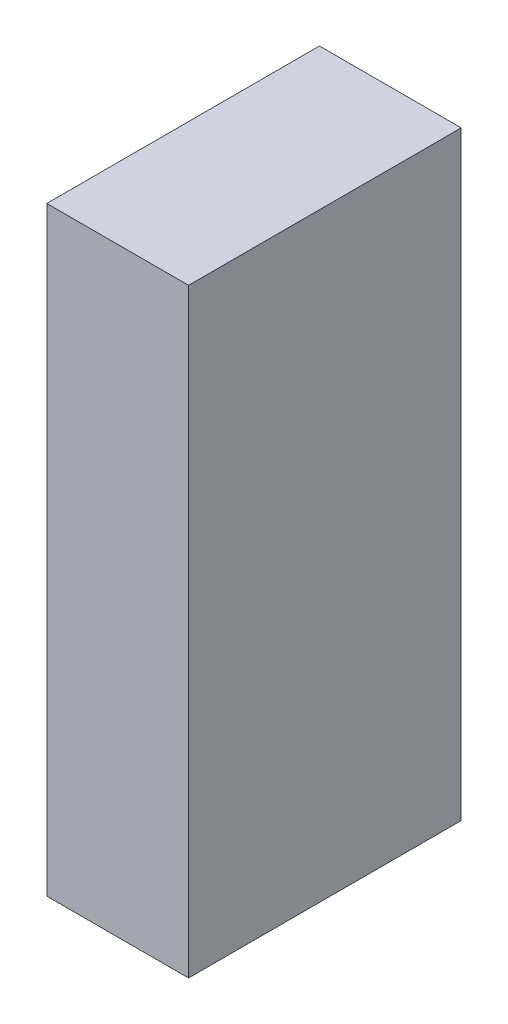
ISO-10303-21;
HEADER;
FILE_DESCRIPTION(('STEP AP214'),'2;1');
FILE_NAME('part.step','',(''),(''),'','','');
FILE_SCHEMA(('AUTOMOTIVE_DESIGN { 1 0 10303 214 1 1 1 1 }'));
ENDSEC;
DATA;
#1=APPLICATION_CONTEXT('core data for automotive mechanical design processes');
#2=APPLICATION_PROTOCOL_DEFINITION('international standard','automotive_design',2000,#1);
#3=PRODUCT_CONTEXT('',#1,'mechanical');
#4=PRODUCT('Part','Part','',(#3));
#5=PRODUCT_RELATED_PRODUCT_CATEGORY('part','',(#4));
#6=PRODUCT_DEFINITION_FORMATION('','',#4);
#7=PRODUCT_DEFINITION_CONTEXT('part definition',#1,'design');
#8=PRODUCT_DEFINITION('design','',#6,#7);
#9=PRODUCT_DEFINITION_SHAPE('','',#8);
#10=(LENGTH_UNIT() NAMED_UNIT(*) SI_UNIT(.MILLI.,.METRE.));
#11=(NAMED_UNIT(*) PLANE_ANGLE_UNIT() SI_UNIT($,.RADIAN.));
#12=(NAMED_UNIT(*) SI_UNIT($,.STERADIAN.) SOLID_ANGLE_UNIT());
#13=UNCERTAINTY_MEASURE_WITH_UNIT(LENGTH_MEASURE(1.E-05),#10,'distance_accuracy_value','');
#14=(GEOMETRIC_REPRESENTATION_CONTEXT(3) GLOBAL_UNCERTAINTY_ASSIGNED_CONTEXT((#13)) GLOBAL_UNIT_ASSIGNED_CONTEXT((#10,
#11,#12)) REPRESENTATION_CONTEXT('',''));
#15=CARTESIAN_POINT('',(0.,0.,0.));
#16=DIRECTION('',(0.,0.,1.));
#17=DIRECTION('',(1.,0.,0.));
#18=AXIS2_PLACEMENT_3D('',#15,#16,#17);
#19=CARTESIAN_POINT('',(26.,-55.,25.));
#20=DIRECTION('',(0.,0.,-1.));
#21=DIRECTION('',(0.,1.,0.));
#22=AXIS2_PLACEMENT_3D('',#19,#20,#21);
#23=PLANE('',#22);
#24=DIRECTION('',(0.,-1.,0.));
#25=VECTOR('',#24,1.);
#26=CARTESIAN_POINT('',(0.,-55.,25.));
#27=LINE('',#26,#25);
#28=CARTESIAN_POINT('',(0.,55.,25.));
#29=VERTEX_POINT('',#28);
#30=CARTESIAN_POINT('',(0.,-55.,25.));
#31=VERTEX_POINT('',#30);
#32=EDGE_CURVE('E96',#29,#31,#27,.T.);
#33=ORIENTED_EDGE('',*,*,#32,.T.);
#34=DIRECTION('',(-1.,0.,0.));
#35=VECTOR('',#34,1.);
#36=CARTESIAN_POINT('',(26.,-55.,25.));
#37=LINE('',#36,#35);
#38=CARTESIAN_POINT('',(26.,-55.,25.));
#39=VERTEX_POINT('',#38);
#40=EDGE_CURVE('E11',#39,#31,#37,.T.);
#41=ORIENTED_EDGE('',*,*,#40,.F.);
#42=DIRECTION('',(0.,-1.,0.));
#43=VECTOR('',#42,1.);
#44=CARTESIAN_POINT('',(26.,-55.,25.));
#45=LINE('',#44,#43);
#46=CARTESIAN_POINT('',(26.,55.,25.));
#47=VERTEX_POINT('',#46);
#48=EDGE_CURVE('E84',#47,#39,#45,.T.);
#49=ORIENTED_EDGE('',*,*,#48,.F.);
#50=DIRECTION('',(-1.,0.,0.));
#51=VECTOR('',#50,1.);
#52=CARTESIAN_POINT('',(26.,55.,25.));
#53=LINE('',#52,#51);
#54=EDGE_CURVE('E92',#47,#29,#53,.T.);
#55=ORIENTED_EDGE('',*,*,#54,.T.);
#56=EDGE_LOOP('',(#33,#41,#49,#55));
#57=FACE_BOUND('',#56,.T.);
#58=ADVANCED_FACE('F33',(#57),#23,.F.);
#59=CARTESIAN_POINT('',(26.,-55.,-25.));
#60=DIRECTION('',(0.,1.,0.));
#61=DIRECTION('',(0.,0.,1.));
#62=AXIS2_PLACEMENT_3D('',#59,#60,#61);
#63=PLANE('',#62);
#64=DIRECTION('',(0.,0.,-1.));
#65=VECTOR('',#64,1.);
#66=CARTESIAN_POINT('',(0.,-55.,-25.));
#67=LINE('',#66,#65);
#68=CARTESIAN_POINT('',(0.,-55.,-25.));
#69=VERTEX_POINT('',#68);
#70=EDGE_CURVE('E88',#31,#69,#67,.T.);
#71=ORIENTED_EDGE('',*,*,#70,.T.);
#72=DIRECTION('',(-1.,0.,0.));
#73=VECTOR('',#72,1.);
#74=CARTESIAN_POINT('',(26.,-55.,-25.));
#75=LINE('',#74,#73);
#76=CARTESIAN_POINT('',(26.,-55.,-25.));
#77=VERTEX_POINT('',#76);
#78=EDGE_CURVE('E41',#77,#69,#75,.T.);
#79=ORIENTED_EDGE('',*,*,#78,.F.);
#80=DIRECTION('',(0.,0.,-1.));
#81=VECTOR('',#80,1.);
#82=CARTESIAN_POINT('',(26.,-55.,-25.));
#83=LINE('',#82,#81);
#84=EDGE_CURVE('E79',#39,#77,#83,.T.);
#85=ORIENTED_EDGE('',*,*,#84,.F.);
#86=ORIENTED_EDGE('',*,*,#40,.T.);
#87=EDGE_LOOP('',(#71,#79,#85,#86));
#88=FACE_BOUND('',#87,.T.);
#89=ADVANCED_FACE('F87',(#88),#63,.F.);
#90=CARTESIAN_POINT('',(26.,-55.,-25.));
#91=DIRECTION('',(0.,0.,1.));
#92=DIRECTION('',(1.,0.,0.));
#93=AXIS2_PLACEMENT_3D('',#90,#91,#92);
#94=PLANE('',#93);
#95=DIRECTION('',(0.,1.,0.));
#96=VECTOR('',#95,1.);
#97=CARTESIAN_POINT('',(0.,-55.,-25.));
#98=LINE('',#97,#96);
#99=CARTESIAN_POINT('',(0.,55.,-25.));
#100=VERTEX_POINT('',#99);
#101=EDGE_CURVE('E66',#69,#100,#98,.T.);
#102=ORIENTED_EDGE('',*,*,#101,.T.);
#103=DIRECTION('',(-1.,0.,0.));
#104=VECTOR('',#103,1.);
#105=CARTESIAN_POINT('',(26.,55.,-25.));
#106=LINE('',#105,#104);
#107=CARTESIAN_POINT('',(26.,55.,-25.));
#108=VERTEX_POINT('',#107);
#109=EDGE_CURVE('E89',#108,#100,#106,.T.);
#110=ORIENTED_EDGE('',*,*,#109,.F.);
#111=DIRECTION('',(0.,1.,0.));
#112=VECTOR('',#111,1.);
#113=CARTESIAN_POINT('',(26.,-55.,-25.));
#114=LINE('',#113,#112);
#115=EDGE_CURVE('E82',#77,#108,#114,.T.);
#116=ORIENTED_EDGE('',*,*,#115,.F.);
#117=ORIENTED_EDGE('',*,*,#78,.T.);
#118=EDGE_LOOP('',(#102,#110,#116,#117));
#119=FACE_BOUND('',#118,.T.);
#120=ADVANCED_FACE('F90',(#119),#94,.F.);
#121=CARTESIAN_POINT('',(26.,55.,-25.));
#122=DIRECTION('',(0.,-1.,0.));
#123=DIRECTION('',(0.,0.,-1.));
#124=AXIS2_PLACEMENT_3D('',#121,#122,#123);
#125=PLANE('',#124);
#126=DIRECTION('',(0.,0.,1.));
#127=VECTOR('',#126,1.);
#128=CARTESIAN_POINT('',(0.,55.,-25.));
#129=LINE('',#128,#127);
#130=EDGE_CURVE('E72',#100,#29,#129,.T.);
#131=ORIENTED_EDGE('',*,*,#130,.T.);
#132=ORIENTED_EDGE('',*,*,#54,.F.);
#133=DIRECTION('',(0.,0.,1.));
#134=VECTOR('',#133,1.);
#135=CARTESIAN_POINT('',(26.,55.,-25.));
#136=LINE('',#135,#134);
#137=EDGE_CURVE('E49',#108,#47,#136,.T.);
#138=ORIENTED_EDGE('',*,*,#137,.F.);
#139=ORIENTED_EDGE('',*,*,#109,.T.);
#140=EDGE_LOOP('',(#131,#132,#138,#139));
#141=FACE_BOUND('',#140,.T.);
#142=ADVANCED_FACE('F103',(#141),#125,.F.);
#143=CARTESIAN_POINT('',(26.,0.,0.));
#144=DIRECTION('',(1.,0.,0.));
#145=DIRECTION('',(0.,0.,-1.));
#146=AXIS2_PLACEMENT_3D('',#143,#144,#145);
#147=PLANE('',#146);
#148=ORIENTED_EDGE('',*,*,#48,.T.);
#149=ORIENTED_EDGE('',*,*,#84,.T.);
#150=ORIENTED_EDGE('',*,*,#115,.T.);
#151=ORIENTED_EDGE('',*,*,#137,.T.);
#152=EDGE_LOOP('',(#148,#149,#150,#151));
#153=FACE_BOUND('',#152,.T.);
#154=ADVANCED_FACE('F80',(#153),#147,.T.);
#155=CARTESIAN_POINT('',(0.,0.,0.));
#156=DIRECTION('',(1.,0.,0.));
#157=DIRECTION('',(0.,0.,-1.));
#158=AXIS2_PLACEMENT_3D('',#155,#156,#157);
#159=PLANE('',#158);
#160=ORIENTED_EDGE('',*,*,#32,.F.);
#161=ORIENTED_EDGE('',*,*,#130,.F.);
#162=ORIENTED_EDGE('',*,*,#101,.F.);
#163=ORIENTED_EDGE('',*,*,#70,.F.);
#164=EDGE_LOOP('',(#160,#161,#162,#163));
#165=FACE_BOUND('',#164,.T.);
#166=ADVANCED_FACE('F106',(#165),#159,.F.);
#167=CLOSED_SHELL('',(#58,#89,#120,#142,#154,#166));
#168=MANIFOLD_SOLID_BREP('B2',#167);
#169=ADVANCED_BREP_SHAPE_REPRESENTATION('',(#18,#168),#14);
#170=SHAPE_DEFINITION_REPRESENTATION(#9,#169);
ENDSEC;
END-ISO-10303-21;
